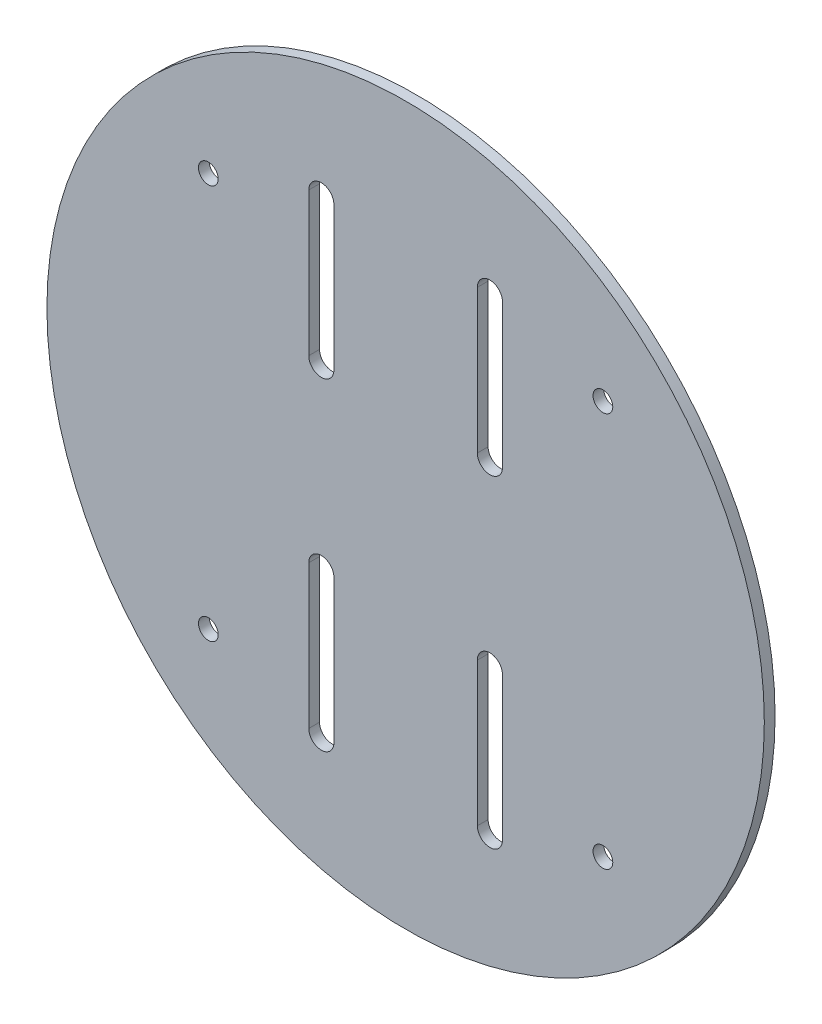
ISO-10303-21;
HEADER;
FILE_DESCRIPTION(('STEP AP214'),'2;1');
FILE_NAME('part.step','',(''),(''),'','','');
FILE_SCHEMA(('AUTOMOTIVE_DESIGN { 1 0 10303 214 1 1 1 1 }'));
ENDSEC;
DATA;
#1=APPLICATION_CONTEXT('core data for automotive mechanical design processes');
#2=APPLICATION_PROTOCOL_DEFINITION('international standard','automotive_design',2000,#1);
#3=PRODUCT_CONTEXT('',#1,'mechanical');
#4=PRODUCT('Part','Part','',(#3));
#5=PRODUCT_RELATED_PRODUCT_CATEGORY('part','',(#4));
#6=PRODUCT_DEFINITION_FORMATION('','',#4);
#7=PRODUCT_DEFINITION_CONTEXT('part definition',#1,'design');
#8=PRODUCT_DEFINITION('design','',#6,#7);
#9=PRODUCT_DEFINITION_SHAPE('','',#8);
#10=(LENGTH_UNIT() NAMED_UNIT(*) SI_UNIT(.MILLI.,.METRE.));
#11=(NAMED_UNIT(*) PLANE_ANGLE_UNIT() SI_UNIT($,.RADIAN.));
#12=(NAMED_UNIT(*) SI_UNIT($,.STERADIAN.) SOLID_ANGLE_UNIT());
#13=UNCERTAINTY_MEASURE_WITH_UNIT(LENGTH_MEASURE(1.E-05),#10,'distance_accuracy_value','');
#14=(GEOMETRIC_REPRESENTATION_CONTEXT(3) GLOBAL_UNCERTAINTY_ASSIGNED_CONTEXT((#13)) GLOBAL_UNIT_ASSIGNED_CONTEXT((#10,
#11,#12)) REPRESENTATION_CONTEXT('',''));
#15=CARTESIAN_POINT('',(0.,0.,0.));
#16=DIRECTION('',(0.,0.,1.));
#17=DIRECTION('',(1.,0.,0.));
#18=AXIS2_PLACEMENT_3D('',#15,#16,#17);
#19=CARTESIAN_POINT('',(0.,0.,30.));
#20=DIRECTION('',(0.,0.,-1.));
#21=DIRECTION('',(-1.,0.,0.));
#22=AXIS2_PLACEMENT_3D('',#19,#20,#21);
#23=CYLINDRICAL_SURFACE('',#22,100.);
#24=CARTESIAN_POINT('',(0.,0.,0.));
#25=DIRECTION('',(0.,0.,1.));
#26=DIRECTION('',(1.,0.,0.));
#27=AXIS2_PLACEMENT_3D('',#24,#25,#26);
#28=CIRCLE('',#27,100.);
#29=CARTESIAN_POINT('',(100.,0.,0.));
#30=VERTEX_POINT('',#29);
#31=EDGE_CURVE('E11',#30,#30,#28,.T.);
#32=ORIENTED_EDGE('',*,*,#31,.T.);
#33=EDGE_LOOP('',(#32));
#34=FACE_BOUND('',#33,.T.);
#35=CARTESIAN_POINT('',(0.,0.,3.));
#36=DIRECTION('',(0.,0.,1.));
#37=DIRECTION('',(1.,0.,0.));
#38=AXIS2_PLACEMENT_3D('',#35,#36,#37);
#39=CIRCLE('',#38,100.);
#40=CARTESIAN_POINT('',(100.,0.,3.));
#41=VERTEX_POINT('',#40);
#42=EDGE_CURVE('E263',#41,#41,#39,.T.);
#43=ORIENTED_EDGE('',*,*,#42,.F.);
#44=EDGE_LOOP('',(#43));
#45=FACE_BOUND('',#44,.T.);
#46=ADVANCED_FACE('F33',(#34,#45),#23,.T.);
#47=CARTESIAN_POINT('',(23.5,65.,0.));
#48=DIRECTION('',(0.,0.,1.));
#49=DIRECTION('',(1.,0.,0.));
#50=AXIS2_PLACEMENT_3D('',#47,#48,#49);
#51=CYLINDRICAL_SURFACE('',#50,3.5);
#52=CARTESIAN_POINT('',(23.5,65.,3.));
#53=DIRECTION('',(0.,0.,1.));
#54=DIRECTION('',(1.,0.,0.));
#55=AXIS2_PLACEMENT_3D('',#52,#53,#54);
#56=CIRCLE('',#55,3.5);
#57=CARTESIAN_POINT('',(20.,65.,3.));
#58=VERTEX_POINT('',#57);
#59=CARTESIAN_POINT('',(27.,65.,3.));
#60=VERTEX_POINT('',#59);
#61=EDGE_CURVE('E261',#58,#60,#56,.F.);
#62=ORIENTED_EDGE('',*,*,#61,.F.);
#63=DIRECTION('',(0.,0.,1.));
#64=VECTOR('',#63,1.);
#65=CARTESIAN_POINT('',(20.,65.,0.));
#66=LINE('',#65,#64);
#67=CARTESIAN_POINT('',(20.,65.,0.));
#68=VERTEX_POINT('',#67);
#69=EDGE_CURVE('E242',#68,#58,#66,.T.);
#70=ORIENTED_EDGE('',*,*,#69,.F.);
#71=CARTESIAN_POINT('',(23.5,65.,0.));
#72=DIRECTION('',(0.,0.,1.));
#73=DIRECTION('',(1.,0.,0.));
#74=AXIS2_PLACEMENT_3D('',#71,#72,#73);
#75=CIRCLE('',#74,3.5);
#76=CARTESIAN_POINT('',(27.,65.,0.));
#77=VERTEX_POINT('',#76);
#78=EDGE_CURVE('E222',#77,#68,#75,.T.);
#79=ORIENTED_EDGE('',*,*,#78,.F.);
#80=DIRECTION('',(0.,0.,1.));
#81=VECTOR('',#80,1.);
#82=CARTESIAN_POINT('',(27.,65.,0.));
#83=LINE('',#82,#81);
#84=EDGE_CURVE('E41',#77,#60,#83,.T.);
#85=ORIENTED_EDGE('',*,*,#84,.T.);
#86=EDGE_LOOP('',(#62,#70,#79,#85));
#87=FACE_BOUND('',#86,.T.);
#88=ADVANCED_FACE('F260',(#87),#51,.F.);
#89=CARTESIAN_POINT('',(27.,65.,0.));
#90=DIRECTION('',(1.,0.,0.));
#91=DIRECTION('',(0.,1.,0.));
#92=AXIS2_PLACEMENT_3D('',#89,#90,#91);
#93=PLANE('',#92);
#94=DIRECTION('',(0.,-1.,0.));
#95=VECTOR('',#94,1.);
#96=CARTESIAN_POINT('',(27.,65.,3.));
#97=LINE('',#96,#95);
#98=CARTESIAN_POINT('',(27.,25.,3.));
#99=VERTEX_POINT('',#98);
#100=EDGE_CURVE('E264',#60,#99,#97,.T.);
#101=ORIENTED_EDGE('',*,*,#100,.F.);
#102=ORIENTED_EDGE('',*,*,#84,.F.);
#103=DIRECTION('',(0.,1.,0.));
#104=VECTOR('',#103,1.);
#105=CARTESIAN_POINT('',(27.,65.,0.));
#106=LINE('',#105,#104);
#107=CARTESIAN_POINT('',(27.,25.,0.));
#108=VERTEX_POINT('',#107);
#109=EDGE_CURVE('E239',#108,#77,#106,.T.);
#110=ORIENTED_EDGE('',*,*,#109,.F.);
#111=DIRECTION('',(0.,0.,1.));
#112=VECTOR('',#111,1.);
#113=CARTESIAN_POINT('',(27.,25.,0.));
#114=LINE('',#113,#112);
#115=EDGE_CURVE('E245',#108,#99,#114,.T.);
#116=ORIENTED_EDGE('',*,*,#115,.T.);
#117=EDGE_LOOP('',(#101,#102,#110,#116));
#118=FACE_BOUND('',#117,.T.);
#119=ADVANCED_FACE('F356',(#118),#93,.F.);
#120=CARTESIAN_POINT('',(23.5,25.,0.));
#121=DIRECTION('',(0.,0.,1.));
#122=DIRECTION('',(1.,0.,0.));
#123=AXIS2_PLACEMENT_3D('',#120,#121,#122);
#124=CYLINDRICAL_SURFACE('',#123,3.5);
#125=CARTESIAN_POINT('',(23.5,25.,3.));
#126=DIRECTION('',(0.,0.,1.));
#127=DIRECTION('',(1.,0.,0.));
#128=AXIS2_PLACEMENT_3D('',#125,#126,#127);
#129=CIRCLE('',#128,3.5);
#130=CARTESIAN_POINT('',(20.,25.,3.));
#131=VERTEX_POINT('',#130);
#132=EDGE_CURVE('E48',#99,#131,#129,.F.);
#133=ORIENTED_EDGE('',*,*,#132,.F.);
#134=ORIENTED_EDGE('',*,*,#115,.F.);
#135=CARTESIAN_POINT('',(23.5,25.,0.));
#136=DIRECTION('',(0.,0.,1.));
#137=DIRECTION('',(1.,0.,0.));
#138=AXIS2_PLACEMENT_3D('',#135,#136,#137);
#139=CIRCLE('',#138,3.5);
#140=CARTESIAN_POINT('',(20.,25.,0.));
#141=VERTEX_POINT('',#140);
#142=EDGE_CURVE('E236',#141,#108,#139,.T.);
#143=ORIENTED_EDGE('',*,*,#142,.F.);
#144=DIRECTION('',(0.,0.,1.));
#145=VECTOR('',#144,1.);
#146=CARTESIAN_POINT('',(20.,25.,0.));
#147=LINE('',#146,#145);
#148=EDGE_CURVE('E248',#141,#131,#147,.T.);
#149=ORIENTED_EDGE('',*,*,#148,.T.);
#150=EDGE_LOOP('',(#133,#134,#143,#149));
#151=FACE_BOUND('',#150,.T.);
#152=ADVANCED_FACE('F375',(#151),#124,.F.);
#153=CARTESIAN_POINT('',(20.,65.,0.));
#154=DIRECTION('',(-1.,0.,0.));
#155=DIRECTION('',(0.,-1.,0.));
#156=AXIS2_PLACEMENT_3D('',#153,#154,#155);
#157=PLANE('',#156);
#158=DIRECTION('',(0.,1.,0.));
#159=VECTOR('',#158,1.);
#160=CARTESIAN_POINT('',(20.,65.,3.));
#161=LINE('',#160,#159);
#162=EDGE_CURVE('E256',#131,#58,#161,.T.);
#163=ORIENTED_EDGE('',*,*,#162,.F.);
#164=ORIENTED_EDGE('',*,*,#148,.F.);
#165=DIRECTION('',(0.,-1.,0.));
#166=VECTOR('',#165,1.);
#167=CARTESIAN_POINT('',(20.,65.,0.));
#168=LINE('',#167,#166);
#169=EDGE_CURVE('E233',#68,#141,#168,.T.);
#170=ORIENTED_EDGE('',*,*,#169,.F.);
#171=ORIENTED_EDGE('',*,*,#69,.T.);
#172=EDGE_LOOP('',(#163,#164,#170,#171));
#173=FACE_BOUND('',#172,.T.);
#174=ADVANCED_FACE('F254',(#173),#157,.F.);
#175=CARTESIAN_POINT('',(-23.5,65.,0.));
#176=DIRECTION('',(0.,0.,1.));
#177=DIRECTION('',(1.,0.,0.));
#178=AXIS2_PLACEMENT_3D('',#175,#176,#177);
#179=CYLINDRICAL_SURFACE('',#178,3.5);
#180=CARTESIAN_POINT('',(-23.5,65.,3.));
#181=DIRECTION('',(0.,0.,1.));
#182=DIRECTION('',(1.,0.,0.));
#183=AXIS2_PLACEMENT_3D('',#180,#181,#182);
#184=CIRCLE('',#183,3.5);
#185=CARTESIAN_POINT('',(-27.,65.,3.));
#186=VERTEX_POINT('',#185);
#187=CARTESIAN_POINT('',(-20.,65.,3.));
#188=VERTEX_POINT('',#187);
#189=EDGE_CURVE('E310',#186,#188,#184,.F.);
#190=ORIENTED_EDGE('',*,*,#189,.F.);
#191=DIRECTION('',(0.,0.,1.));
#192=VECTOR('',#191,1.);
#193=CARTESIAN_POINT('',(-27.,65.,0.));
#194=LINE('',#193,#192);
#195=CARTESIAN_POINT('',(-27.,65.,0.));
#196=VERTEX_POINT('',#195);
#197=EDGE_CURVE('E218',#196,#186,#194,.T.);
#198=ORIENTED_EDGE('',*,*,#197,.F.);
#199=CARTESIAN_POINT('',(-23.5,65.,0.));
#200=DIRECTION('',(0.,0.,1.));
#201=DIRECTION('',(1.,0.,0.));
#202=AXIS2_PLACEMENT_3D('',#199,#200,#201);
#203=CIRCLE('',#202,3.5);
#204=CARTESIAN_POINT('',(-20.,65.,0.));
#205=VERTEX_POINT('',#204);
#206=EDGE_CURVE('E198',#205,#196,#203,.T.);
#207=ORIENTED_EDGE('',*,*,#206,.F.);
#208=DIRECTION('',(0.,0.,1.));
#209=VECTOR('',#208,1.);
#210=CARTESIAN_POINT('',(-20.,65.,0.));
#211=LINE('',#210,#209);
#212=EDGE_CURVE('E219',#205,#188,#211,.T.);
#213=ORIENTED_EDGE('',*,*,#212,.T.);
#214=EDGE_LOOP('',(#190,#198,#207,#213));
#215=FACE_BOUND('',#214,.T.);
#216=ADVANCED_FACE('F374',(#215),#179,.F.);
#217=CARTESIAN_POINT('',(-20.,65.,0.));
#218=DIRECTION('',(1.,0.,0.));
#219=DIRECTION('',(0.,1.,0.));
#220=AXIS2_PLACEMENT_3D('',#217,#218,#219);
#221=PLANE('',#220);
#222=DIRECTION('',(0.,-1.,0.));
#223=VECTOR('',#222,1.);
#224=CARTESIAN_POINT('',(-20.,65.,3.));
#225=LINE('',#224,#223);
#226=CARTESIAN_POINT('',(-20.,25.,3.));
#227=VERTEX_POINT('',#226);
#228=EDGE_CURVE('E308',#188,#227,#225,.T.);
#229=ORIENTED_EDGE('',*,*,#228,.F.);
#230=ORIENTED_EDGE('',*,*,#212,.F.);
#231=DIRECTION('',(0.,1.,0.));
#232=VECTOR('',#231,1.);
#233=CARTESIAN_POINT('',(-20.,65.,0.));
#234=LINE('',#233,#232);
#235=CARTESIAN_POINT('',(-20.,25.,0.));
#236=VERTEX_POINT('',#235);
#237=EDGE_CURVE('E215',#236,#205,#234,.T.);
#238=ORIENTED_EDGE('',*,*,#237,.F.);
#239=DIRECTION('',(0.,0.,1.));
#240=VECTOR('',#239,1.);
#241=CARTESIAN_POINT('',(-20.,25.,0.));
#242=LINE('',#241,#240);
#243=EDGE_CURVE('E223',#236,#227,#242,.T.);
#244=ORIENTED_EDGE('',*,*,#243,.T.);
#245=EDGE_LOOP('',(#229,#230,#238,#244));
#246=FACE_BOUND('',#245,.T.);
#247=ADVANCED_FACE('F384',(#246),#221,.F.);
#248=CARTESIAN_POINT('',(-23.5,25.,0.));
#249=DIRECTION('',(0.,0.,1.));
#250=DIRECTION('',(1.,0.,0.));
#251=AXIS2_PLACEMENT_3D('',#248,#249,#250);
#252=CYLINDRICAL_SURFACE('',#251,3.5);
#253=CARTESIAN_POINT('',(-23.5,25.,3.));
#254=DIRECTION('',(0.,0.,1.));
#255=DIRECTION('',(1.,0.,0.));
#256=AXIS2_PLACEMENT_3D('',#253,#254,#255);
#257=CIRCLE('',#256,3.5);
#258=CARTESIAN_POINT('',(-27.,25.,3.));
#259=VERTEX_POINT('',#258);
#260=EDGE_CURVE('E56',#227,#259,#257,.F.);
#261=ORIENTED_EDGE('',*,*,#260,.F.);
#262=ORIENTED_EDGE('',*,*,#243,.F.);
#263=CARTESIAN_POINT('',(-23.5,25.,0.));
#264=DIRECTION('',(0.,0.,1.));
#265=DIRECTION('',(1.,0.,0.));
#266=AXIS2_PLACEMENT_3D('',#263,#264,#265);
#267=CIRCLE('',#266,3.5);
#268=CARTESIAN_POINT('',(-27.,25.,0.));
#269=VERTEX_POINT('',#268);
#270=EDGE_CURVE('E212',#269,#236,#267,.T.);
#271=ORIENTED_EDGE('',*,*,#270,.F.);
#272=DIRECTION('',(0.,0.,1.));
#273=VECTOR('',#272,1.);
#274=CARTESIAN_POINT('',(-27.,25.,0.));
#275=LINE('',#274,#273);
#276=EDGE_CURVE('E226',#269,#259,#275,.T.);
#277=ORIENTED_EDGE('',*,*,#276,.T.);
#278=EDGE_LOOP('',(#261,#262,#271,#277));
#279=FACE_BOUND('',#278,.T.);
#280=ADVANCED_FACE('F390',(#279),#252,.F.);
#281=CARTESIAN_POINT('',(-27.,65.,0.));
#282=DIRECTION('',(-1.,0.,0.));
#283=DIRECTION('',(0.,-1.,0.));
#284=AXIS2_PLACEMENT_3D('',#281,#282,#283);
#285=PLANE('',#284);
#286=DIRECTION('',(0.,1.,0.));
#287=VECTOR('',#286,1.);
#288=CARTESIAN_POINT('',(-27.,65.,3.));
#289=LINE('',#288,#287);
#290=EDGE_CURVE('E305',#259,#186,#289,.T.);
#291=ORIENTED_EDGE('',*,*,#290,.F.);
#292=ORIENTED_EDGE('',*,*,#276,.F.);
#293=DIRECTION('',(0.,-1.,0.));
#294=VECTOR('',#293,1.);
#295=CARTESIAN_POINT('',(-27.,65.,0.));
#296=LINE('',#295,#294);
#297=EDGE_CURVE('E209',#196,#269,#296,.T.);
#298=ORIENTED_EDGE('',*,*,#297,.F.);
#299=ORIENTED_EDGE('',*,*,#197,.T.);
#300=EDGE_LOOP('',(#291,#292,#298,#299));
#301=FACE_BOUND('',#300,.T.);
#302=ADVANCED_FACE('F386',(#301),#285,.F.);
#303=CARTESIAN_POINT('',(-23.5,-25.,0.));
#304=DIRECTION('',(0.,0.,1.));
#305=DIRECTION('',(1.,0.,0.));
#306=AXIS2_PLACEMENT_3D('',#303,#304,#305);
#307=CYLINDRICAL_SURFACE('',#306,3.5);
#308=CARTESIAN_POINT('',(-23.5,-25.,3.));
#309=DIRECTION('',(0.,0.,1.));
#310=DIRECTION('',(1.,0.,0.));
#311=AXIS2_PLACEMENT_3D('',#308,#309,#310);
#312=CIRCLE('',#311,3.5);
#313=CARTESIAN_POINT('',(-27.,-25.,3.));
#314=VERTEX_POINT('',#313);
#315=CARTESIAN_POINT('',(-20.,-25.,3.));
#316=VERTEX_POINT('',#315);
#317=EDGE_CURVE('E303',#314,#316,#312,.F.);
#318=ORIENTED_EDGE('',*,*,#317,.F.);
#319=DIRECTION('',(0.,0.,1.));
#320=VECTOR('',#319,1.);
#321=CARTESIAN_POINT('',(-27.,-25.,0.));
#322=LINE('',#321,#320);
#323=CARTESIAN_POINT('',(-27.,-25.,0.));
#324=VERTEX_POINT('',#323);
#325=EDGE_CURVE('E194',#324,#314,#322,.T.);
#326=ORIENTED_EDGE('',*,*,#325,.F.);
#327=CARTESIAN_POINT('',(-23.5,-25.,0.));
#328=DIRECTION('',(0.,0.,1.));
#329=DIRECTION('',(1.,0.,0.));
#330=AXIS2_PLACEMENT_3D('',#327,#328,#329);
#331=CIRCLE('',#330,3.5);
#332=CARTESIAN_POINT('',(-20.,-25.,0.));
#333=VERTEX_POINT('',#332);
#334=EDGE_CURVE('E182',#333,#324,#331,.T.);
#335=ORIENTED_EDGE('',*,*,#334,.F.);
#336=DIRECTION('',(0.,0.,1.));
#337=VECTOR('',#336,1.);
#338=CARTESIAN_POINT('',(-20.,-25.,0.));
#339=LINE('',#338,#337);
#340=EDGE_CURVE('E195',#333,#316,#339,.T.);
#341=ORIENTED_EDGE('',*,*,#340,.T.);
#342=EDGE_LOOP('',(#318,#326,#335,#341));
#343=FACE_BOUND('',#342,.T.);
#344=ADVANCED_FACE('F389',(#343),#307,.F.);
#345=CARTESIAN_POINT('',(-20.,-25.,0.));
#346=DIRECTION('',(1.,0.,0.));
#347=DIRECTION('',(0.,1.,0.));
#348=AXIS2_PLACEMENT_3D('',#345,#346,#347);
#349=PLANE('',#348);
#350=DIRECTION('',(0.,-1.,0.));
#351=VECTOR('',#350,1.);
#352=CARTESIAN_POINT('',(-20.,-25.,3.));
#353=LINE('',#352,#351);
#354=CARTESIAN_POINT('',(-20.,-65.,3.));
#355=VERTEX_POINT('',#354);
#356=EDGE_CURVE('E301',#316,#355,#353,.T.);
#357=ORIENTED_EDGE('',*,*,#356,.F.);
#358=ORIENTED_EDGE('',*,*,#340,.F.);
#359=DIRECTION('',(0.,1.,0.));
#360=VECTOR('',#359,1.);
#361=CARTESIAN_POINT('',(-20.,-25.,0.));
#362=LINE('',#361,#360);
#363=CARTESIAN_POINT('',(-20.,-65.,0.));
#364=VERTEX_POINT('',#363);
#365=EDGE_CURVE('E191',#364,#333,#362,.T.);
#366=ORIENTED_EDGE('',*,*,#365,.F.);
#367=DIRECTION('',(0.,0.,1.));
#368=VECTOR('',#367,1.);
#369=CARTESIAN_POINT('',(-20.,-65.,0.));
#370=LINE('',#369,#368);
#371=EDGE_CURVE('E199',#364,#355,#370,.T.);
#372=ORIENTED_EDGE('',*,*,#371,.T.);
#373=EDGE_LOOP('',(#357,#358,#366,#372));
#374=FACE_BOUND('',#373,.T.);
#375=ADVANCED_FACE('F400',(#374),#349,.F.);
#376=CARTESIAN_POINT('',(-23.5,-65.,0.));
#377=DIRECTION('',(0.,0.,1.));
#378=DIRECTION('',(1.,0.,0.));
#379=AXIS2_PLACEMENT_3D('',#376,#377,#378);
#380=CYLINDRICAL_SURFACE('',#379,3.5);
#381=CARTESIAN_POINT('',(-23.5,-65.,3.));
#382=DIRECTION('',(0.,0.,1.));
#383=DIRECTION('',(1.,0.,0.));
#384=AXIS2_PLACEMENT_3D('',#381,#382,#383);
#385=CIRCLE('',#384,3.5);
#386=CARTESIAN_POINT('',(-27.,-65.,3.));
#387=VERTEX_POINT('',#386);
#388=EDGE_CURVE('E299',#355,#387,#385,.F.);
#389=ORIENTED_EDGE('',*,*,#388,.F.);
#390=ORIENTED_EDGE('',*,*,#371,.F.);
#391=CARTESIAN_POINT('',(-23.5,-65.,0.));
#392=DIRECTION('',(0.,0.,1.));
#393=DIRECTION('',(1.,0.,0.));
#394=AXIS2_PLACEMENT_3D('',#391,#392,#393);
#395=CIRCLE('',#394,3.5);
#396=CARTESIAN_POINT('',(-27.,-65.,0.));
#397=VERTEX_POINT('',#396);
#398=EDGE_CURVE('E188',#397,#364,#395,.T.);
#399=ORIENTED_EDGE('',*,*,#398,.F.);
#400=DIRECTION('',(0.,0.,1.));
#401=VECTOR('',#400,1.);
#402=CARTESIAN_POINT('',(-27.,-65.,0.));
#403=LINE('',#402,#401);
#404=EDGE_CURVE('E202',#397,#387,#403,.T.);
#405=ORIENTED_EDGE('',*,*,#404,.T.);
#406=EDGE_LOOP('',(#389,#390,#399,#405));
#407=FACE_BOUND('',#406,.T.);
#408=ADVANCED_FACE('F405',(#407),#380,.F.);
#409=CARTESIAN_POINT('',(-27.,-25.,0.));
#410=DIRECTION('',(-1.,0.,0.));
#411=DIRECTION('',(0.,-1.,0.));
#412=AXIS2_PLACEMENT_3D('',#409,#410,#411);
#413=PLANE('',#412);
#414=DIRECTION('',(0.,1.,0.));
#415=VECTOR('',#414,1.);
#416=CARTESIAN_POINT('',(-27.,-25.,3.));
#417=LINE('',#416,#415);
#418=EDGE_CURVE('E165',#387,#314,#417,.T.);
#419=ORIENTED_EDGE('',*,*,#418,.F.);
#420=ORIENTED_EDGE('',*,*,#404,.F.);
#421=DIRECTION('',(0.,-1.,0.));
#422=VECTOR('',#421,1.);
#423=CARTESIAN_POINT('',(-27.,-25.,0.));
#424=LINE('',#423,#422);
#425=EDGE_CURVE('E185',#324,#397,#424,.T.);
#426=ORIENTED_EDGE('',*,*,#425,.F.);
#427=ORIENTED_EDGE('',*,*,#325,.T.);
#428=EDGE_LOOP('',(#419,#420,#426,#427));
#429=FACE_BOUND('',#428,.T.);
#430=ADVANCED_FACE('F402',(#429),#413,.F.);
#431=CARTESIAN_POINT('',(23.5,-65.,0.));
#432=DIRECTION('',(0.,0.,1.));
#433=DIRECTION('',(1.,0.,0.));
#434=AXIS2_PLACEMENT_3D('',#431,#432,#433);
#435=CYLINDRICAL_SURFACE('',#434,3.50000000000001);
#436=CARTESIAN_POINT('',(23.5,-65.,3.));
#437=DIRECTION('',(0.,0.,1.));
#438=DIRECTION('',(1.,0.,0.));
#439=AXIS2_PLACEMENT_3D('',#436,#437,#438);
#440=CIRCLE('',#439,3.50000000000001);
#441=CARTESIAN_POINT('',(27.,-65.,3.));
#442=VERTEX_POINT('',#441);
#443=CARTESIAN_POINT('',(20.,-65.,3.));
#444=VERTEX_POINT('',#443);
#445=EDGE_CURVE('E148',#442,#444,#440,.F.);
#446=ORIENTED_EDGE('',*,*,#445,.F.);
#447=DIRECTION('',(0.,0.,1.));
#448=VECTOR('',#447,1.);
#449=CARTESIAN_POINT('',(27.,-65.,0.));
#450=LINE('',#449,#448);
#451=CARTESIAN_POINT('',(27.,-65.,0.));
#452=VERTEX_POINT('',#451);
#453=EDGE_CURVE('E162',#452,#442,#450,.T.);
#454=ORIENTED_EDGE('',*,*,#453,.F.);
#455=CARTESIAN_POINT('',(23.5,-65.,0.));
#456=DIRECTION('',(0.,0.,1.));
#457=DIRECTION('',(1.,0.,0.));
#458=AXIS2_PLACEMENT_3D('',#455,#456,#457);
#459=CIRCLE('',#458,3.50000000000001);
#460=CARTESIAN_POINT('',(20.,-65.,0.));
#461=VERTEX_POINT('',#460);
#462=EDGE_CURVE('E283',#461,#452,#459,.T.);
#463=ORIENTED_EDGE('',*,*,#462,.F.);
#464=DIRECTION('',(0.,0.,1.));
#465=VECTOR('',#464,1.);
#466=CARTESIAN_POINT('',(20.,-65.,0.));
#467=LINE('',#466,#465);
#468=EDGE_CURVE('E164',#461,#444,#467,.T.);
#469=ORIENTED_EDGE('',*,*,#468,.T.);
#470=EDGE_LOOP('',(#446,#454,#463,#469));
#471=FACE_BOUND('',#470,.T.);
#472=ADVANCED_FACE('F160',(#471),#435,.F.);
#473=CARTESIAN_POINT('',(20.,-65.,0.));
#474=DIRECTION('',(-1.,0.,0.));
#475=DIRECTION('',(0.,-1.,0.));
#476=AXIS2_PLACEMENT_3D('',#473,#474,#475);
#477=PLANE('',#476);
#478=DIRECTION('',(0.,1.,0.));
#479=VECTOR('',#478,1.);
#480=CARTESIAN_POINT('',(20.,-65.,3.));
#481=LINE('',#480,#479);
#482=CARTESIAN_POINT('',(20.,-25.,3.));
#483=VERTEX_POINT('',#482);
#484=EDGE_CURVE('E166',#444,#483,#481,.T.);
#485=ORIENTED_EDGE('',*,*,#484,.F.);
#486=ORIENTED_EDGE('',*,*,#468,.F.);
#487=DIRECTION('',(0.,-1.,0.));
#488=VECTOR('',#487,1.);
#489=CARTESIAN_POINT('',(20.,-65.,0.));
#490=LINE('',#489,#488);
#491=CARTESIAN_POINT('',(20.,-25.,0.));
#492=VERTEX_POINT('',#491);
#493=EDGE_CURVE('E173',#492,#461,#490,.T.);
#494=ORIENTED_EDGE('',*,*,#493,.F.);
#495=DIRECTION('',(0.,0.,1.));
#496=VECTOR('',#495,1.);
#497=CARTESIAN_POINT('',(20.,-25.,0.));
#498=LINE('',#497,#496);
#499=EDGE_CURVE('E175',#492,#483,#498,.T.);
#500=ORIENTED_EDGE('',*,*,#499,.T.);
#501=EDGE_LOOP('',(#485,#486,#494,#500));
#502=FACE_BOUND('',#501,.T.);
#503=ADVANCED_FACE('F291',(#502),#477,.F.);
#504=CARTESIAN_POINT('',(23.5,-25.,0.));
#505=DIRECTION('',(0.,0.,1.));
#506=DIRECTION('',(1.,0.,0.));
#507=AXIS2_PLACEMENT_3D('',#504,#505,#506);
#508=CYLINDRICAL_SURFACE('',#507,3.50000000000001);
#509=CARTESIAN_POINT('',(23.5,-25.,3.));
#510=DIRECTION('',(0.,0.,1.));
#511=DIRECTION('',(1.,0.,0.));
#512=AXIS2_PLACEMENT_3D('',#509,#510,#511);
#513=CIRCLE('',#512,3.50000000000001);
#514=CARTESIAN_POINT('',(27.,-25.,3.));
#515=VERTEX_POINT('',#514);
#516=EDGE_CURVE('E151',#483,#515,#513,.F.);
#517=ORIENTED_EDGE('',*,*,#516,.F.);
#518=ORIENTED_EDGE('',*,*,#499,.F.);
#519=CARTESIAN_POINT('',(23.5,-25.,0.));
#520=DIRECTION('',(0.,0.,1.));
#521=DIRECTION('',(1.,0.,0.));
#522=AXIS2_PLACEMENT_3D('',#519,#520,#521);
#523=CIRCLE('',#522,3.50000000000001);
#524=CARTESIAN_POINT('',(27.,-25.,0.));
#525=VERTEX_POINT('',#524);
#526=EDGE_CURVE('E178',#525,#492,#523,.T.);
#527=ORIENTED_EDGE('',*,*,#526,.F.);
#528=DIRECTION('',(0.,0.,1.));
#529=VECTOR('',#528,1.);
#530=CARTESIAN_POINT('',(27.,-25.,0.));
#531=LINE('',#530,#529);
#532=EDGE_CURVE('E172',#525,#515,#531,.T.);
#533=ORIENTED_EDGE('',*,*,#532,.T.);
#534=EDGE_LOOP('',(#517,#518,#527,#533));
#535=FACE_BOUND('',#534,.T.);
#536=ADVANCED_FACE('F293',(#535),#508,.F.);
#537=CARTESIAN_POINT('',(27.,-65.,0.));
#538=DIRECTION('',(1.,0.,0.));
#539=DIRECTION('',(0.,1.,0.));
#540=AXIS2_PLACEMENT_3D('',#537,#538,#539);
#541=PLANE('',#540);
#542=DIRECTION('',(0.,-1.,0.));
#543=VECTOR('',#542,1.);
#544=CARTESIAN_POINT('',(27.,-65.,3.));
#545=LINE('',#544,#543);
#546=EDGE_CURVE('E145',#515,#442,#545,.T.);
#547=ORIENTED_EDGE('',*,*,#546,.F.);
#548=ORIENTED_EDGE('',*,*,#532,.F.);
#549=DIRECTION('',(0.,1.,0.));
#550=VECTOR('',#549,1.);
#551=CARTESIAN_POINT('',(27.,-65.,0.));
#552=LINE('',#551,#550);
#553=EDGE_CURVE('E170',#452,#525,#552,.T.);
#554=ORIENTED_EDGE('',*,*,#553,.F.);
#555=ORIENTED_EDGE('',*,*,#453,.T.);
#556=EDGE_LOOP('',(#547,#548,#554,#555));
#557=FACE_BOUND('',#556,.T.);
#558=ADVANCED_FACE('F168',(#557),#541,.F.);
#559=CARTESIAN_POINT('',(-55.,-55.,30.));
#560=DIRECTION('',(0.,0.,1.));
#561=DIRECTION('',(1.,0.,0.));
#562=AXIS2_PLACEMENT_3D('',#559,#560,#561);
#563=CYLINDRICAL_SURFACE('',#562,2.74999999999999);
#564=CARTESIAN_POINT('',(-55.,-55.,0.));
#565=DIRECTION('',(0.,0.,1.));
#566=DIRECTION('',(1.,0.,0.));
#567=AXIS2_PLACEMENT_3D('',#564,#565,#566);
#568=CIRCLE('',#567,2.75);
#569=CARTESIAN_POINT('',(-52.25,-55.,0.));
#570=VERTEX_POINT('',#569);
#571=EDGE_CURVE('E280',#570,#570,#568,.T.);
#572=ORIENTED_EDGE('',*,*,#571,.F.);
#573=EDGE_LOOP('',(#572));
#574=FACE_BOUND('',#573,.T.);
#575=CARTESIAN_POINT('',(-55.,-55.,3.));
#576=DIRECTION('',(0.,0.,1.));
#577=DIRECTION('',(1.,0.,0.));
#578=AXIS2_PLACEMENT_3D('',#575,#576,#577);
#579=CIRCLE('',#578,2.74999999999999);
#580=CARTESIAN_POINT('',(-52.25,-55.,3.));
#581=VERTEX_POINT('',#580);
#582=EDGE_CURVE('E156',#581,#581,#579,.F.);
#583=ORIENTED_EDGE('',*,*,#582,.F.);
#584=EDGE_LOOP('',(#583));
#585=FACE_BOUND('',#584,.T.);
#586=ADVANCED_FACE('F338',(#574,#585),#563,.F.);
#587=CARTESIAN_POINT('',(55.,-55.,30.));
#588=DIRECTION('',(0.,0.,1.));
#589=DIRECTION('',(1.,0.,0.));
#590=AXIS2_PLACEMENT_3D('',#587,#588,#589);
#591=CYLINDRICAL_SURFACE('',#590,2.74999999999999);
#592=CARTESIAN_POINT('',(55.,-55.,0.));
#593=DIRECTION('',(0.,0.,1.));
#594=DIRECTION('',(1.,0.,0.));
#595=AXIS2_PLACEMENT_3D('',#592,#593,#594);
#596=CIRCLE('',#595,2.75);
#597=CARTESIAN_POINT('',(57.75,-55.,0.));
#598=VERTEX_POINT('',#597);
#599=EDGE_CURVE('E277',#598,#598,#596,.T.);
#600=ORIENTED_EDGE('',*,*,#599,.F.);
#601=EDGE_LOOP('',(#600));
#602=FACE_BOUND('',#601,.T.);
#603=CARTESIAN_POINT('',(55.,-55.,3.));
#604=DIRECTION('',(0.,0.,1.));
#605=DIRECTION('',(1.,0.,0.));
#606=AXIS2_PLACEMENT_3D('',#603,#604,#605);
#607=CIRCLE('',#606,2.74999999999999);
#608=CARTESIAN_POINT('',(57.75,-55.,3.));
#609=VERTEX_POINT('',#608);
#610=EDGE_CURVE('E331',#609,#609,#607,.F.);
#611=ORIENTED_EDGE('',*,*,#610,.F.);
#612=EDGE_LOOP('',(#611));
#613=FACE_BOUND('',#612,.T.);
#614=ADVANCED_FACE('F335',(#602,#613),#591,.F.);
#615=CARTESIAN_POINT('',(55.,55.,30.));
#616=DIRECTION('',(0.,0.,1.));
#617=DIRECTION('',(1.,0.,0.));
#618=AXIS2_PLACEMENT_3D('',#615,#616,#617);
#619=CYLINDRICAL_SURFACE('',#618,2.74999999999999);
#620=CARTESIAN_POINT('',(55.,55.,0.));
#621=DIRECTION('',(0.,0.,1.));
#622=DIRECTION('',(1.,0.,0.));
#623=AXIS2_PLACEMENT_3D('',#620,#621,#622);
#624=CIRCLE('',#623,2.75);
#625=CARTESIAN_POINT('',(57.75,55.,0.));
#626=VERTEX_POINT('',#625);
#627=EDGE_CURVE('E274',#626,#626,#624,.T.);
#628=ORIENTED_EDGE('',*,*,#627,.F.);
#629=EDGE_LOOP('',(#628));
#630=FACE_BOUND('',#629,.T.);
#631=CARTESIAN_POINT('',(55.,55.,3.));
#632=DIRECTION('',(0.,0.,1.));
#633=DIRECTION('',(1.,0.,0.));
#634=AXIS2_PLACEMENT_3D('',#631,#632,#633);
#635=CIRCLE('',#634,2.74999999999999);
#636=CARTESIAN_POINT('',(57.75,55.,3.));
#637=VERTEX_POINT('',#636);
#638=EDGE_CURVE('E325',#637,#637,#635,.F.);
#639=ORIENTED_EDGE('',*,*,#638,.F.);
#640=EDGE_LOOP('',(#639));
#641=FACE_BOUND('',#640,.T.);
#642=ADVANCED_FACE('F337',(#630,#641),#619,.F.);
#643=CARTESIAN_POINT('',(-55.,55.,30.));
#644=DIRECTION('',(0.,0.,1.));
#645=DIRECTION('',(1.,0.,0.));
#646=AXIS2_PLACEMENT_3D('',#643,#644,#645);
#647=CYLINDRICAL_SURFACE('',#646,2.74999999999999);
#648=CARTESIAN_POINT('',(-55.,55.,0.));
#649=DIRECTION('',(0.,0.,1.));
#650=DIRECTION('',(1.,0.,0.));
#651=AXIS2_PLACEMENT_3D('',#648,#649,#650);
#652=CIRCLE('',#651,2.75);
#653=CARTESIAN_POINT('',(-52.25,55.,0.));
#654=VERTEX_POINT('',#653);
#655=EDGE_CURVE('E267',#654,#654,#652,.T.);
#656=ORIENTED_EDGE('',*,*,#655,.F.);
#657=EDGE_LOOP('',(#656));
#658=FACE_BOUND('',#657,.T.);
#659=CARTESIAN_POINT('',(-55.,55.,3.));
#660=DIRECTION('',(0.,0.,1.));
#661=DIRECTION('',(1.,0.,0.));
#662=AXIS2_PLACEMENT_3D('',#659,#660,#661);
#663=CIRCLE('',#662,2.74999999999999);
#664=CARTESIAN_POINT('',(-52.25,55.,3.));
#665=VERTEX_POINT('',#664);
#666=EDGE_CURVE('E36',#665,#665,#663,.F.);
#667=ORIENTED_EDGE('',*,*,#666,.F.);
#668=EDGE_LOOP('',(#667));
#669=FACE_BOUND('',#668,.T.);
#670=ADVANCED_FACE('F345',(#658,#669),#647,.F.);
#671=CARTESIAN_POINT('',(0.,0.,0.));
#672=DIRECTION('',(0.,0.,1.));
#673=DIRECTION('',(1.,0.,0.));
#674=AXIS2_PLACEMENT_3D('',#671,#672,#673);
#675=PLANE('',#674);
#676=ORIENTED_EDGE('',*,*,#655,.T.);
#677=EDGE_LOOP('',(#676));
#678=FACE_BOUND('',#677,.T.);
#679=ORIENTED_EDGE('',*,*,#627,.T.);
#680=EDGE_LOOP('',(#679));
#681=FACE_BOUND('',#680,.T.);
#682=ORIENTED_EDGE('',*,*,#599,.T.);
#683=EDGE_LOOP('',(#682));
#684=FACE_BOUND('',#683,.T.);
#685=ORIENTED_EDGE('',*,*,#571,.T.);
#686=EDGE_LOOP('',(#685));
#687=FACE_BOUND('',#686,.T.);
#688=ORIENTED_EDGE('',*,*,#493,.T.);
#689=ORIENTED_EDGE('',*,*,#462,.T.);
#690=ORIENTED_EDGE('',*,*,#553,.T.);
#691=ORIENTED_EDGE('',*,*,#526,.T.);
#692=EDGE_LOOP('',(#688,#689,#690,#691));
#693=FACE_BOUND('',#692,.T.);
#694=ORIENTED_EDGE('',*,*,#365,.T.);
#695=ORIENTED_EDGE('',*,*,#334,.T.);
#696=ORIENTED_EDGE('',*,*,#425,.T.);
#697=ORIENTED_EDGE('',*,*,#398,.T.);
#698=EDGE_LOOP('',(#694,#695,#696,#697));
#699=FACE_BOUND('',#698,.T.);
#700=ORIENTED_EDGE('',*,*,#237,.T.);
#701=ORIENTED_EDGE('',*,*,#206,.T.);
#702=ORIENTED_EDGE('',*,*,#297,.T.);
#703=ORIENTED_EDGE('',*,*,#270,.T.);
#704=EDGE_LOOP('',(#700,#701,#702,#703));
#705=FACE_BOUND('',#704,.T.);
#706=ORIENTED_EDGE('',*,*,#109,.T.);
#707=ORIENTED_EDGE('',*,*,#78,.T.);
#708=ORIENTED_EDGE('',*,*,#169,.T.);
#709=ORIENTED_EDGE('',*,*,#142,.T.);
#710=EDGE_LOOP('',(#706,#707,#708,#709));
#711=FACE_BOUND('',#710,.T.);
#712=ORIENTED_EDGE('',*,*,#31,.F.);
#713=EDGE_LOOP('',(#712));
#714=FACE_BOUND('',#713,.T.);
#715=ADVANCED_FACE('F314',(#678,#681,#684,#687,#693,#699,#705,#711,#714),#675,.F.);
#716=CARTESIAN_POINT('',(0.,8.47946863205231,3.));
#717=DIRECTION('',(0.,0.,1.));
#718=DIRECTION('',(1.,0.,0.));
#719=AXIS2_PLACEMENT_3D('',#716,#717,#718);
#720=PLANE('',#719);
#721=ORIENTED_EDGE('',*,*,#61,.T.);
#722=ORIENTED_EDGE('',*,*,#100,.T.);
#723=ORIENTED_EDGE('',*,*,#132,.T.);
#724=ORIENTED_EDGE('',*,*,#162,.T.);
#725=EDGE_LOOP('',(#721,#722,#723,#724));
#726=FACE_BOUND('',#725,.T.);
#727=ORIENTED_EDGE('',*,*,#317,.T.);
#728=ORIENTED_EDGE('',*,*,#356,.T.);
#729=ORIENTED_EDGE('',*,*,#388,.T.);
#730=ORIENTED_EDGE('',*,*,#418,.T.);
#731=EDGE_LOOP('',(#727,#728,#729,#730));
#732=FACE_BOUND('',#731,.T.);
#733=ORIENTED_EDGE('',*,*,#582,.T.);
#734=EDGE_LOOP('',(#733));
#735=FACE_BOUND('',#734,.T.);
#736=ORIENTED_EDGE('',*,*,#638,.T.);
#737=EDGE_LOOP('',(#736));
#738=FACE_BOUND('',#737,.T.);
#739=ORIENTED_EDGE('',*,*,#666,.T.);
#740=EDGE_LOOP('',(#739));
#741=FACE_BOUND('',#740,.T.);
#742=ORIENTED_EDGE('',*,*,#610,.T.);
#743=EDGE_LOOP('',(#742));
#744=FACE_BOUND('',#743,.T.);
#745=ORIENTED_EDGE('',*,*,#445,.T.);
#746=ORIENTED_EDGE('',*,*,#484,.T.);
#747=ORIENTED_EDGE('',*,*,#516,.T.);
#748=ORIENTED_EDGE('',*,*,#546,.T.);
#749=EDGE_LOOP('',(#745,#746,#747,#748));
#750=FACE_BOUND('',#749,.T.);
#751=ORIENTED_EDGE('',*,*,#189,.T.);
#752=ORIENTED_EDGE('',*,*,#228,.T.);
#753=ORIENTED_EDGE('',*,*,#260,.T.);
#754=ORIENTED_EDGE('',*,*,#290,.T.);
#755=EDGE_LOOP('',(#751,#752,#753,#754));
#756=FACE_BOUND('',#755,.T.);
#757=ORIENTED_EDGE('',*,*,#42,.T.);
#758=EDGE_LOOP('',(#757));
#759=FACE_BOUND('',#758,.T.);
#760=ADVANCED_FACE('F147',(#726,#732,#735,#738,#741,#744,#750,#756,#759),#720,.T.);
#761=CLOSED_SHELL('',(#46,#88,#119,#152,#174,#216,#247,#280,#302,#344,#375,#408,#430,#472,#503,
#536,#558,#586,#614,#642,#670,#715,#760));
#762=MANIFOLD_SOLID_BREP('B2',#761);
#763=ADVANCED_BREP_SHAPE_REPRESENTATION('',(#18,#762),#14);
#764=SHAPE_DEFINITION_REPRESENTATION(#9,#763);
ENDSEC;
END-ISO-10303-21;
